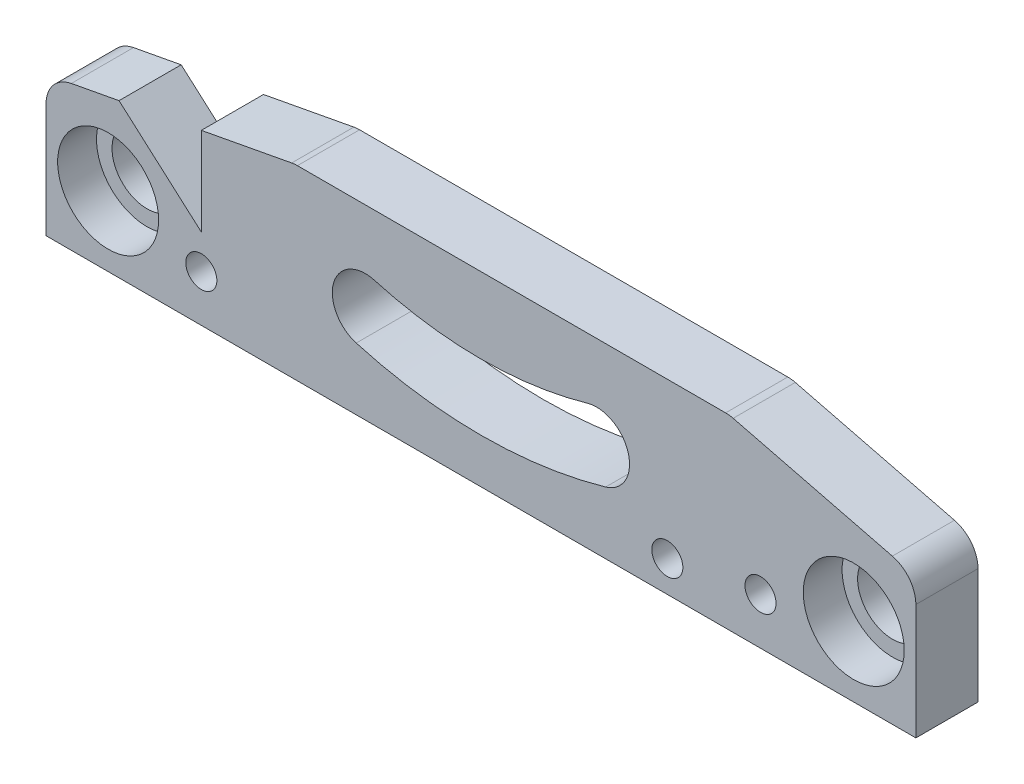
ISO-10303-21;
HEADER;
FILE_DESCRIPTION(('STEP AP214'),'2;1');
FILE_NAME('part.step','',(''),(''),'','','');
FILE_SCHEMA(('AUTOMOTIVE_DESIGN { 1 0 10303 214 1 1 1 1 }'));
ENDSEC;
DATA;
#1=APPLICATION_CONTEXT('core data for automotive mechanical design processes');
#2=APPLICATION_PROTOCOL_DEFINITION('international standard','automotive_design',2000,#1);
#3=PRODUCT_CONTEXT('',#1,'mechanical');
#4=PRODUCT('Part','Part','',(#3));
#5=PRODUCT_RELATED_PRODUCT_CATEGORY('part','',(#4));
#6=PRODUCT_DEFINITION_FORMATION('','',#4);
#7=PRODUCT_DEFINITION_CONTEXT('part definition',#1,'design');
#8=PRODUCT_DEFINITION('design','',#6,#7);
#9=PRODUCT_DEFINITION_SHAPE('','',#8);
#10=(LENGTH_UNIT() NAMED_UNIT(*) SI_UNIT(.MILLI.,.METRE.));
#11=(NAMED_UNIT(*) PLANE_ANGLE_UNIT() SI_UNIT($,.RADIAN.));
#12=(NAMED_UNIT(*) SI_UNIT($,.STERADIAN.) SOLID_ANGLE_UNIT());
#13=UNCERTAINTY_MEASURE_WITH_UNIT(LENGTH_MEASURE(1.E-05),#10,'distance_accuracy_value','');
#14=(GEOMETRIC_REPRESENTATION_CONTEXT(3) GLOBAL_UNCERTAINTY_ASSIGNED_CONTEXT((#13)) GLOBAL_UNIT_ASSIGNED_CONTEXT((#10,
#11,#12)) REPRESENTATION_CONTEXT('',''));
#15=CARTESIAN_POINT('',(0.,0.,0.));
#16=DIRECTION('',(0.,0.,1.));
#17=DIRECTION('',(1.,0.,0.));
#18=AXIS2_PLACEMENT_3D('',#15,#16,#17);
#19=CARTESIAN_POINT('',(-44.45,19.05,0.));
#20=DIRECTION('',(0.,0.,1.));
#21=DIRECTION('',(1.,0.,0.));
#22=AXIS2_PLACEMENT_3D('',#19,#20,#21);
#23=PLANE('',#22);
#24=CARTESIAN_POINT('',(-28.575,4.7625,0.));
#25=DIRECTION('',(0.,0.,1.));
#26=DIRECTION('',(1.,0.,0.));
#27=AXIS2_PLACEMENT_3D('',#24,#25,#26);
#28=CIRCLE('',#27,1.5875);
#29=CARTESIAN_POINT('',(-26.9875,4.7625,0.));
#30=VERTEX_POINT('',#29);
#31=EDGE_CURVE('E619',#30,#30,#28,.T.);
#32=ORIENTED_EDGE('',*,*,#31,.T.);
#33=EDGE_LOOP('',(#32));
#34=FACE_BOUND('',#33,.T.);
#35=CARTESIAN_POINT('',(19.05,3.17500000000001,0.));
#36=DIRECTION('',(0.,0.,1.));
#37=DIRECTION('',(1.,0.,0.));
#38=AXIS2_PLACEMENT_3D('',#35,#36,#37);
#39=CIRCLE('',#38,1.5875);
#40=CARTESIAN_POINT('',(20.6375,3.17500000000001,0.));
#41=VERTEX_POINT('',#40);
#42=EDGE_CURVE('E608',#41,#41,#39,.T.);
#43=ORIENTED_EDGE('',*,*,#42,.T.);
#44=EDGE_LOOP('',(#43));
#45=FACE_BOUND('',#44,.T.);
#46=CARTESIAN_POINT('',(28.575,4.7625,0.));
#47=DIRECTION('',(0.,0.,1.));
#48=DIRECTION('',(1.,0.,0.));
#49=AXIS2_PLACEMENT_3D('',#46,#47,#48);
#50=CIRCLE('',#49,1.5875);
#51=CARTESIAN_POINT('',(30.1625,4.7625,0.));
#52=VERTEX_POINT('',#51);
#53=EDGE_CURVE('E604',#52,#52,#50,.T.);
#54=ORIENTED_EDGE('',*,*,#53,.T.);
#55=EDGE_LOOP('',(#54));
#56=FACE_BOUND('',#55,.T.);
#57=CARTESIAN_POINT('',(-38.1,7.14375,0.));
#58=DIRECTION('',(0.,0.,1.));
#59=DIRECTION('',(1.,0.,0.));
#60=AXIS2_PLACEMENT_3D('',#57,#58,#59);
#61=CIRCLE('',#60,3.57187500000001);
#62=CARTESIAN_POINT('',(-34.528125,7.14375,0.));
#63=VERTEX_POINT('',#62);
#64=EDGE_CURVE('E592',#63,#63,#61,.T.);
#65=ORIENTED_EDGE('',*,*,#64,.T.);
#66=EDGE_LOOP('',(#65));
#67=FACE_BOUND('',#66,.T.);
#68=CARTESIAN_POINT('',(-11.8145061637062,9.59792055784382,0.));
#69=DIRECTION('',(0.,0.,-1.));
#70=DIRECTION('',(-1.,0.,0.));
#71=AXIS2_PLACEMENT_3D('',#68,#69,#70);
#72=CIRCLE('',#71,3.3734375);
#73=CARTESIAN_POINT('',(-12.74435155622,6.35516430545188,0.));
#74=VERTEX_POINT('',#73);
#75=CARTESIAN_POINT('',(-10.8846607711922,12.8406768102357,0.));
#76=VERTEX_POINT('',#75);
#77=EDGE_CURVE('E152',#74,#76,#72,.T.);
#78=ORIENTED_EDGE('',*,*,#77,.F.);
#79=CARTESIAN_POINT('',(0.,50.8,0.));
#80=DIRECTION('',(0.,0.,-1.));
#81=DIRECTION('',(-1.,0.,0.));
#82=AXIS2_PLACEMENT_3D('',#79,#80,#81);
#83=CIRCLE('',#82,46.2359375);
#84=CARTESIAN_POINT('',(12.7443515562201,6.35516430545189,0.));
#85=VERTEX_POINT('',#84);
#86=EDGE_CURVE('E177',#85,#74,#83,.T.);
#87=ORIENTED_EDGE('',*,*,#86,.F.);
#88=CARTESIAN_POINT('',(11.8145061637062,9.59792055784382,0.));
#89=DIRECTION('',(0.,0.,-1.));
#90=DIRECTION('',(-1.,0.,0.));
#91=AXIS2_PLACEMENT_3D('',#88,#89,#90);
#92=CIRCLE('',#91,3.3734375);
#93=CARTESIAN_POINT('',(10.8846607711922,12.8406768102357,0.));
#94=VERTEX_POINT('',#93);
#95=EDGE_CURVE('E175',#94,#85,#92,.T.);
#96=ORIENTED_EDGE('',*,*,#95,.F.);
#97=CARTESIAN_POINT('',(0.,50.8,0.));
#98=DIRECTION('',(0.,0.,1.));
#99=DIRECTION('',(1.,0.,0.));
#100=AXIS2_PLACEMENT_3D('',#97,#98,#99);
#101=CIRCLE('',#100,39.4890625);
#102=EDGE_CURVE('E162',#76,#94,#101,.T.);
#103=ORIENTED_EDGE('',*,*,#102,.F.);
#104=EDGE_LOOP('',(#78,#87,#96,#103));
#105=FACE_BOUND('',#104,.T.);
#106=DIRECTION('',(-0.970142500145332,0.242535625036333,0.));
#107=VECTOR('',#106,1.);
#108=CARTESIAN_POINT('',(44.45,14.2875,0.));
#109=LINE('',#108,#107);
#110=CARTESIAN_POINT('',(42.0450506094903,14.8887373476274,0.));
#111=VERTEX_POINT('',#110);
#112=CARTESIAN_POINT('',(25.7791902481543,18.9552024379614,0.));
#113=VERTEX_POINT('',#112);
#114=EDGE_CURVE('E220',#111,#113,#109,.T.);
#115=ORIENTED_EDGE('',*,*,#114,.F.);
#116=CARTESIAN_POINT('',(41.275,11.808534909666,0.));
#117=DIRECTION('',(0.,0.,1.));
#118=DIRECTION('',(1.,0.,0.));
#119=AXIS2_PLACEMENT_3D('',#116,#117,#118);
#120=CIRCLE('',#119,3.175);
#121=CARTESIAN_POINT('',(44.45,11.808534909666,0.));
#122=VERTEX_POINT('',#121);
#123=EDGE_CURVE('E273',#111,#122,#120,.F.);
#124=ORIENTED_EDGE('',*,*,#123,.T.);
#125=DIRECTION('',(0.,1.,0.));
#126=VECTOR('',#125,1.);
#127=CARTESIAN_POINT('',(44.45,0.,0.));
#128=LINE('',#127,#126);
#129=CARTESIAN_POINT('',(44.45,0.,0.));
#130=VERTEX_POINT('',#129);
#131=EDGE_CURVE('E242',#130,#122,#128,.T.);
#132=ORIENTED_EDGE('',*,*,#131,.F.);
#133=DIRECTION('',(-1.,0.,0.));
#134=VECTOR('',#133,1.);
#135=CARTESIAN_POINT('',(44.45,0.,0.));
#136=LINE('',#135,#134);
#137=CARTESIAN_POINT('',(-44.45,0.,0.));
#138=VERTEX_POINT('',#137);
#139=EDGE_CURVE('E245',#130,#138,#136,.T.);
#140=ORIENTED_EDGE('',*,*,#139,.T.);
#141=DIRECTION('',(0.,1.,0.));
#142=VECTOR('',#141,1.);
#143=CARTESIAN_POINT('',(-44.45,0.,0.));
#144=LINE('',#143,#142);
#145=CARTESIAN_POINT('',(-44.45,11.6524840379615,0.));
#146=VERTEX_POINT('',#145);
#147=EDGE_CURVE('E230',#138,#146,#144,.T.);
#148=ORIENTED_EDGE('',*,*,#147,.T.);
#149=CARTESIAN_POINT('',(-41.275,11.6524840379615,0.));
#150=DIRECTION('',(0.,0.,1.));
#151=DIRECTION('',(1.,0.,0.));
#152=AXIS2_PLACEMENT_3D('',#149,#150,#151);
#153=CIRCLE('',#152,3.175);
#154=CARTESIAN_POINT('',(-41.8601160987843,14.7731032314779,0.));
#155=VERTEX_POINT('',#154);
#156=EDGE_CURVE('E47',#146,#155,#153,.F.);
#157=ORIENTED_EDGE('',*,*,#156,.T.);
#158=DIRECTION('',(-0.982872186934322,-0.184288535050185,0.));
#159=VECTOR('',#158,1.);
#160=CARTESIAN_POINT('',(-43.587358490566,14.4492452830189,0.));
#161=LINE('',#160,#159);
#162=CARTESIAN_POINT('',(-36.9843867316346,15.6873024878185,0.));
#163=VERTEX_POINT('',#162);
#164=EDGE_CURVE('E216',#163,#155,#161,.T.);
#165=ORIENTED_EDGE('',*,*,#164,.F.);
#166=DIRECTION('',(0.749616947953284,-0.661871914603727,0.));
#167=VECTOR('',#166,1.);
#168=CARTESIAN_POINT('',(-36.9843867316346,15.6873024878185,0.));
#169=LINE('',#168,#167);
#170=CARTESIAN_POINT('',(-28.575,8.26226105578167,0.));
#171=VERTEX_POINT('',#170);
#172=EDGE_CURVE('E198',#163,#171,#169,.T.);
#173=ORIENTED_EDGE('',*,*,#172,.T.);
#174=DIRECTION('',(0.,1.,0.));
#175=VECTOR('',#174,1.);
#176=CARTESIAN_POINT('',(-28.575,8.26226105578167,0.));
#177=LINE('',#176,#175);
#178=CARTESIAN_POINT('',(-28.575,17.2640625,0.));
#179=VERTEX_POINT('',#178);
#180=EDGE_CURVE('E195',#171,#179,#177,.T.);
#181=ORIENTED_EDGE('',*,*,#180,.T.);
#182=CARTESIAN_POINT('',(-19.3400309679121,18.9956191935165,0.));
#183=VERTEX_POINT('',#182);
#184=EDGE_CURVE('E217',#183,#179,#161,.T.);
#185=ORIENTED_EDGE('',*,*,#184,.F.);
#186=CARTESIAN_POINT('',(-18.7549148691278,15.875,0.));
#187=DIRECTION('',(0.,0.,1.));
#188=DIRECTION('',(1.,0.,0.));
#189=AXIS2_PLACEMENT_3D('',#186,#187,#188);
#190=CIRCLE('',#189,3.175);
#191=CARTESIAN_POINT('',(-18.7549148691278,19.05,0.));
#192=VERTEX_POINT('',#191);
#193=EDGE_CURVE('E270',#183,#192,#190,.F.);
#194=ORIENTED_EDGE('',*,*,#193,.T.);
#195=DIRECTION('',(1.,0.,0.));
#196=VECTOR('',#195,1.);
#197=CARTESIAN_POINT('',(-44.45,19.05,0.));
#198=LINE('',#197,#196);
#199=CARTESIAN_POINT('',(25.0091396386639,19.05,0.));
#200=VERTEX_POINT('',#199);
#201=EDGE_CURVE('E223',#192,#200,#198,.T.);
#202=ORIENTED_EDGE('',*,*,#201,.T.);
#203=CARTESIAN_POINT('',(25.0091396386639,15.875,0.));
#204=DIRECTION('',(0.,0.,1.));
#205=DIRECTION('',(1.,0.,0.));
#206=AXIS2_PLACEMENT_3D('',#203,#204,#205);
#207=CIRCLE('',#206,3.175);
#208=EDGE_CURVE('E268',#200,#113,#207,.F.);
#209=ORIENTED_EDGE('',*,*,#208,.T.);
#210=EDGE_LOOP('',(#115,#124,#132,#140,#148,#157,#165,#173,#181,#185,#194,#202,#209));
#211=FACE_BOUND('',#210,.T.);
#212=CARTESIAN_POINT('',(38.1,7.14375,0.));
#213=DIRECTION('',(0.,0.,1.));
#214=DIRECTION('',(1.,0.,0.));
#215=AXIS2_PLACEMENT_3D('',#212,#213,#214);
#216=CIRCLE('',#215,3.57187500000001);
#217=CARTESIAN_POINT('',(41.671875,7.14375,0.));
#218=VERTEX_POINT('',#217);
#219=EDGE_CURVE('E184',#218,#218,#216,.T.);
#220=ORIENTED_EDGE('',*,*,#219,.T.);
#221=EDGE_LOOP('',(#220));
#222=FACE_BOUND('',#221,.T.);
#223=ADVANCED_FACE('F32',(#34,#45,#56,#67,#105,#211,#222),#23,.F.);
#224=CARTESIAN_POINT('',(-44.45,19.05,6.35));
#225=DIRECTION('',(0.,0.,1.));
#226=DIRECTION('',(1.,0.,0.));
#227=AXIS2_PLACEMENT_3D('',#224,#225,#226);
#228=PLANE('',#227);
#229=CARTESIAN_POINT('',(-28.575,4.7625,6.35));
#230=DIRECTION('',(0.,0.,1.));
#231=DIRECTION('',(1.,0.,0.));
#232=AXIS2_PLACEMENT_3D('',#229,#230,#231);
#233=CIRCLE('',#232,1.5875);
#234=CARTESIAN_POINT('',(-26.9875,4.7625,6.35));
#235=VERTEX_POINT('',#234);
#236=EDGE_CURVE('E614',#235,#235,#233,.T.);
#237=ORIENTED_EDGE('',*,*,#236,.F.);
#238=EDGE_LOOP('',(#237));
#239=FACE_BOUND('',#238,.T.);
#240=CARTESIAN_POINT('',(19.05,3.17500000000001,6.34999999994079));
#241=DIRECTION('',(0.,0.,1.));
#242=DIRECTION('',(1.,0.,0.));
#243=AXIS2_PLACEMENT_3D('',#240,#241,#242);
#244=CIRCLE('',#243,1.5875);
#245=CARTESIAN_POINT('',(20.6375,3.17500000000001,6.34999999994079));
#246=VERTEX_POINT('',#245);
#247=EDGE_CURVE('E611',#246,#246,#244,.T.);
#248=ORIENTED_EDGE('',*,*,#247,.F.);
#249=EDGE_LOOP('',(#248));
#250=FACE_BOUND('',#249,.T.);
#251=CARTESIAN_POINT('',(28.575,4.7625,6.35));
#252=DIRECTION('',(0.,0.,1.));
#253=DIRECTION('',(1.,0.,0.));
#254=AXIS2_PLACEMENT_3D('',#251,#252,#253);
#255=CIRCLE('',#254,1.5875);
#256=CARTESIAN_POINT('',(30.1625,4.7625,6.35));
#257=VERTEX_POINT('',#256);
#258=EDGE_CURVE('E605',#257,#257,#255,.T.);
#259=ORIENTED_EDGE('',*,*,#258,.F.);
#260=EDGE_LOOP('',(#259));
#261=FACE_BOUND('',#260,.T.);
#262=CARTESIAN_POINT('',(-38.1,7.14375,6.35));
#263=DIRECTION('',(0.,0.,1.));
#264=DIRECTION('',(1.,0.,0.));
#265=AXIS2_PLACEMENT_3D('',#262,#263,#264);
#266=CIRCLE('',#265,5.15937499999999);
#267=CARTESIAN_POINT('',(-32.940625,7.14375,6.35));
#268=VERTEX_POINT('',#267);
#269=EDGE_CURVE('E601',#268,#268,#266,.T.);
#270=ORIENTED_EDGE('',*,*,#269,.F.);
#271=EDGE_LOOP('',(#270));
#272=FACE_BOUND('',#271,.T.);
#273=CARTESIAN_POINT('',(0.,50.8,6.35));
#274=DIRECTION('',(0.,0.,-1.));
#275=DIRECTION('',(-1.,0.,0.));
#276=AXIS2_PLACEMENT_3D('',#273,#274,#275);
#277=CIRCLE('',#276,46.2359375);
#278=CARTESIAN_POINT('',(12.7443515562201,6.35516430545189,6.35));
#279=VERTEX_POINT('',#278);
#280=CARTESIAN_POINT('',(-12.74435155622,6.35516430545188,6.35));
#281=VERTEX_POINT('',#280);
#282=EDGE_CURVE('E163',#279,#281,#277,.T.);
#283=ORIENTED_EDGE('',*,*,#282,.T.);
#284=CARTESIAN_POINT('',(-11.8145061637062,9.59792055784382,6.35));
#285=DIRECTION('',(0.,0.,-1.));
#286=DIRECTION('',(-1.,0.,0.));
#287=AXIS2_PLACEMENT_3D('',#284,#285,#286);
#288=CIRCLE('',#287,3.3734375);
#289=CARTESIAN_POINT('',(-10.8846607711922,12.8406768102357,6.35));
#290=VERTEX_POINT('',#289);
#291=EDGE_CURVE('E182',#281,#290,#288,.T.);
#292=ORIENTED_EDGE('',*,*,#291,.T.);
#293=CARTESIAN_POINT('',(0.,50.8,6.35));
#294=DIRECTION('',(0.,0.,1.));
#295=DIRECTION('',(1.,0.,0.));
#296=AXIS2_PLACEMENT_3D('',#293,#294,#295);
#297=CIRCLE('',#296,39.4890625);
#298=CARTESIAN_POINT('',(10.8846607711922,12.8406768102357,6.35));
#299=VERTEX_POINT('',#298);
#300=EDGE_CURVE('E169',#290,#299,#297,.T.);
#301=ORIENTED_EDGE('',*,*,#300,.T.);
#302=CARTESIAN_POINT('',(11.8145061637062,9.59792055784382,6.35));
#303=DIRECTION('',(0.,0.,-1.));
#304=DIRECTION('',(-1.,0.,0.));
#305=AXIS2_PLACEMENT_3D('',#302,#303,#304);
#306=CIRCLE('',#305,3.3734375);
#307=EDGE_CURVE('E186',#299,#279,#306,.T.);
#308=ORIENTED_EDGE('',*,*,#307,.T.);
#309=EDGE_LOOP('',(#283,#292,#301,#308));
#310=FACE_BOUND('',#309,.T.);
#311=DIRECTION('',(0.,1.,0.));
#312=VECTOR('',#311,1.);
#313=CARTESIAN_POINT('',(44.45,0.,6.35));
#314=LINE('',#313,#312);
#315=CARTESIAN_POINT('',(44.45,0.,6.35));
#316=VERTEX_POINT('',#315);
#317=CARTESIAN_POINT('',(44.45,11.808534909666,6.35));
#318=VERTEX_POINT('',#317);
#319=EDGE_CURVE('E229',#316,#318,#314,.T.);
#320=ORIENTED_EDGE('',*,*,#319,.T.);
#321=CARTESIAN_POINT('',(41.275,11.808534909666,6.35));
#322=DIRECTION('',(0.,0.,1.));
#323=DIRECTION('',(1.,0.,0.));
#324=AXIS2_PLACEMENT_3D('',#321,#322,#323);
#325=CIRCLE('',#324,3.175);
#326=CARTESIAN_POINT('',(42.0450506094903,14.8887373476274,6.35));
#327=VERTEX_POINT('',#326);
#328=EDGE_CURVE('E261',#318,#327,#325,.T.);
#329=ORIENTED_EDGE('',*,*,#328,.T.);
#330=DIRECTION('',(-0.970142500145332,0.242535625036333,0.));
#331=VECTOR('',#330,1.);
#332=CARTESIAN_POINT('',(44.45,14.2875,6.35));
#333=LINE('',#332,#331);
#334=CARTESIAN_POINT('',(25.7791902481543,18.9552024379614,6.35));
#335=VERTEX_POINT('',#334);
#336=EDGE_CURVE('E219',#327,#335,#333,.T.);
#337=ORIENTED_EDGE('',*,*,#336,.T.);
#338=CARTESIAN_POINT('',(25.0091396386639,15.875,6.35));
#339=DIRECTION('',(0.,0.,1.));
#340=DIRECTION('',(1.,0.,0.));
#341=AXIS2_PLACEMENT_3D('',#338,#339,#340);
#342=CIRCLE('',#341,3.175);
#343=CARTESIAN_POINT('',(25.0091396386639,19.05,6.35));
#344=VERTEX_POINT('',#343);
#345=EDGE_CURVE('E255',#335,#344,#342,.T.);
#346=ORIENTED_EDGE('',*,*,#345,.T.);
#347=DIRECTION('',(1.,0.,0.));
#348=VECTOR('',#347,1.);
#349=CARTESIAN_POINT('',(-44.45,19.05,6.35));
#350=LINE('',#349,#348);
#351=CARTESIAN_POINT('',(-18.7549148691278,19.05,6.35));
#352=VERTEX_POINT('',#351);
#353=EDGE_CURVE('E226',#352,#344,#350,.T.);
#354=ORIENTED_EDGE('',*,*,#353,.F.);
#355=CARTESIAN_POINT('',(-18.7549148691278,15.875,6.35));
#356=DIRECTION('',(0.,0.,1.));
#357=DIRECTION('',(1.,0.,0.));
#358=AXIS2_PLACEMENT_3D('',#355,#356,#357);
#359=CIRCLE('',#358,3.175);
#360=CARTESIAN_POINT('',(-19.3400309679121,18.9956191935165,6.35));
#361=VERTEX_POINT('',#360);
#362=EDGE_CURVE('E257',#352,#361,#359,.T.);
#363=ORIENTED_EDGE('',*,*,#362,.T.);
#364=DIRECTION('',(0.982872186934322,0.184288535050185,0.));
#365=VECTOR('',#364,1.);
#366=CARTESIAN_POINT('',(-44.45,14.2875,6.35));
#367=LINE('',#366,#365);
#368=CARTESIAN_POINT('',(-28.575,17.2640625,6.35));
#369=VERTEX_POINT('',#368);
#370=EDGE_CURVE('E213',#369,#361,#367,.T.);
#371=ORIENTED_EDGE('',*,*,#370,.F.);
#372=DIRECTION('',(0.,1.,0.));
#373=VECTOR('',#372,1.);
#374=CARTESIAN_POINT('',(-28.575,8.26226105578167,6.35));
#375=LINE('',#374,#373);
#376=CARTESIAN_POINT('',(-28.575,8.26226105578167,6.35));
#377=VERTEX_POINT('',#376);
#378=EDGE_CURVE('E170',#377,#369,#375,.T.);
#379=ORIENTED_EDGE('',*,*,#378,.F.);
#380=DIRECTION('',(0.749616947953284,-0.661871914603727,0.));
#381=VECTOR('',#380,1.);
#382=CARTESIAN_POINT('',(-36.9843867316346,15.6873024878185,6.35));
#383=LINE('',#382,#381);
#384=CARTESIAN_POINT('',(-36.9843867316346,15.6873024878185,6.35));
#385=VERTEX_POINT('',#384);
#386=EDGE_CURVE('E199',#385,#377,#383,.T.);
#387=ORIENTED_EDGE('',*,*,#386,.F.);
#388=CARTESIAN_POINT('',(-41.8601160987843,14.7731032314779,6.35));
#389=VERTEX_POINT('',#388);
#390=EDGE_CURVE('E214',#389,#385,#367,.T.);
#391=ORIENTED_EDGE('',*,*,#390,.F.);
#392=CARTESIAN_POINT('',(-41.275,11.6524840379615,6.35));
#393=DIRECTION('',(0.,0.,1.));
#394=DIRECTION('',(1.,0.,0.));
#395=AXIS2_PLACEMENT_3D('',#392,#393,#394);
#396=CIRCLE('',#395,3.175);
#397=CARTESIAN_POINT('',(-44.45,11.6524840379615,6.35));
#398=VERTEX_POINT('',#397);
#399=EDGE_CURVE('E259',#389,#398,#396,.T.);
#400=ORIENTED_EDGE('',*,*,#399,.T.);
#401=DIRECTION('',(0.,1.,0.));
#402=VECTOR('',#401,1.);
#403=CARTESIAN_POINT('',(-44.45,0.,6.35));
#404=LINE('',#403,#402);
#405=CARTESIAN_POINT('',(-44.45,0.,6.35));
#406=VERTEX_POINT('',#405);
#407=EDGE_CURVE('E236',#406,#398,#404,.T.);
#408=ORIENTED_EDGE('',*,*,#407,.F.);
#409=DIRECTION('',(-1.,0.,0.));
#410=VECTOR('',#409,1.);
#411=CARTESIAN_POINT('',(44.45,0.,6.35));
#412=LINE('',#411,#410);
#413=EDGE_CURVE('E233',#316,#406,#412,.T.);
#414=ORIENTED_EDGE('',*,*,#413,.F.);
#415=EDGE_LOOP('',(#320,#329,#337,#346,#354,#363,#371,#379,#387,#391,#400,#408,#414));
#416=FACE_BOUND('',#415,.T.);
#417=CARTESIAN_POINT('',(38.1,7.14375,6.35));
#418=DIRECTION('',(0.,0.,1.));
#419=DIRECTION('',(1.,0.,0.));
#420=AXIS2_PLACEMENT_3D('',#417,#418,#419);
#421=CIRCLE('',#420,5.15937499999999);
#422=CARTESIAN_POINT('',(43.259375,7.14375,6.35));
#423=VERTEX_POINT('',#422);
#424=EDGE_CURVE('E589',#423,#423,#421,.T.);
#425=ORIENTED_EDGE('',*,*,#424,.F.);
#426=EDGE_LOOP('',(#425));
#427=FACE_BOUND('',#426,.T.);
#428=ADVANCED_FACE('F298',(#239,#250,#261,#272,#310,#416,#427),#228,.T.);
#429=CARTESIAN_POINT('',(-44.45,14.2875,6.35));
#430=DIRECTION('',(-0.184288535050185,0.982872186934322,0.));
#431=DIRECTION('',(-0.982872186934322,-0.184288535050185,0.));
#432=AXIS2_PLACEMENT_3D('',#429,#430,#431);
#433=PLANE('',#432);
#434=ORIENTED_EDGE('',*,*,#370,.T.);
#435=DIRECTION('',(0.,0.,-1.));
#436=VECTOR('',#435,1.);
#437=CARTESIAN_POINT('',(-19.3400309679121,18.9956191935165,6.35));
#438=LINE('',#437,#436);
#439=EDGE_CURVE('E279',#361,#183,#438,.T.);
#440=ORIENTED_EDGE('',*,*,#439,.T.);
#441=ORIENTED_EDGE('',*,*,#184,.T.);
#442=DIRECTION('',(0.,0.,1.));
#443=VECTOR('',#442,1.);
#444=CARTESIAN_POINT('',(-28.575,17.2640625,0.));
#445=LINE('',#444,#443);
#446=EDGE_CURVE('E210',#179,#369,#445,.T.);
#447=ORIENTED_EDGE('',*,*,#446,.T.);
#448=EDGE_LOOP('',(#434,#440,#441,#447));
#449=FACE_BOUND('',#448,.T.);
#450=ADVANCED_FACE('F333',(#449),#433,.T.);
#451=CARTESIAN_POINT('',(-44.45,19.05,6.35));
#452=DIRECTION('',(0.,1.,0.));
#453=DIRECTION('',(-1.,0.,0.));
#454=AXIS2_PLACEMENT_3D('',#451,#452,#453);
#455=PLANE('',#454);
#456=ORIENTED_EDGE('',*,*,#201,.F.);
#457=DIRECTION('',(0.,0.,-1.));
#458=VECTOR('',#457,1.);
#459=CARTESIAN_POINT('',(-18.7549148691278,19.05,6.35));
#460=LINE('',#459,#458);
#461=EDGE_CURVE('E11',#192,#352,#460,.F.);
#462=ORIENTED_EDGE('',*,*,#461,.T.);
#463=ORIENTED_EDGE('',*,*,#353,.T.);
#464=DIRECTION('',(0.,0.,1.));
#465=VECTOR('',#464,1.);
#466=CARTESIAN_POINT('',(25.0091396386639,19.05,6.35));
#467=LINE('',#466,#465);
#468=EDGE_CURVE('E40',#344,#200,#467,.F.);
#469=ORIENTED_EDGE('',*,*,#468,.T.);
#470=EDGE_LOOP('',(#456,#462,#463,#469));
#471=FACE_BOUND('',#470,.T.);
#472=ADVANCED_FACE('F284',(#471),#455,.T.);
#473=CARTESIAN_POINT('',(-44.45,0.,6.35));
#474=DIRECTION('',(-1.,0.,0.));
#475=DIRECTION('',(0.,-1.,0.));
#476=AXIS2_PLACEMENT_3D('',#473,#474,#475);
#477=PLANE('',#476);
#478=ORIENTED_EDGE('',*,*,#407,.T.);
#479=DIRECTION('',(0.,0.,-1.));
#480=VECTOR('',#479,1.);
#481=CARTESIAN_POINT('',(-44.45,11.6524840379615,6.35));
#482=LINE('',#481,#480);
#483=EDGE_CURVE('E275',#398,#146,#482,.T.);
#484=ORIENTED_EDGE('',*,*,#483,.T.);
#485=ORIENTED_EDGE('',*,*,#147,.F.);
#486=DIRECTION('',(0.,0.,-1.));
#487=VECTOR('',#486,1.);
#488=CARTESIAN_POINT('',(-44.45,0.,6.35));
#489=LINE('',#488,#487);
#490=EDGE_CURVE('E249',#406,#138,#489,.T.);
#491=ORIENTED_EDGE('',*,*,#490,.F.);
#492=EDGE_LOOP('',(#478,#484,#485,#491));
#493=FACE_BOUND('',#492,.T.);
#494=ADVANCED_FACE('F315',(#493),#477,.T.);
#495=CARTESIAN_POINT('',(44.45,0.,6.35));
#496=DIRECTION('',(-1.,0.,0.));
#497=DIRECTION('',(0.,-1.,0.));
#498=AXIS2_PLACEMENT_3D('',#495,#496,#497);
#499=PLANE('',#498);
#500=ORIENTED_EDGE('',*,*,#131,.T.);
#501=DIRECTION('',(0.,0.,1.));
#502=VECTOR('',#501,1.);
#503=CARTESIAN_POINT('',(44.45,11.808534909666,6.35));
#504=LINE('',#503,#502);
#505=EDGE_CURVE('E251',#122,#318,#504,.T.);
#506=ORIENTED_EDGE('',*,*,#505,.T.);
#507=ORIENTED_EDGE('',*,*,#319,.F.);
#508=DIRECTION('',(0.,0.,-1.));
#509=VECTOR('',#508,1.);
#510=CARTESIAN_POINT('',(44.45,0.,6.35));
#511=LINE('',#510,#509);
#512=EDGE_CURVE('E239',#316,#130,#511,.T.);
#513=ORIENTED_EDGE('',*,*,#512,.T.);
#514=EDGE_LOOP('',(#500,#506,#507,#513));
#515=FACE_BOUND('',#514,.T.);
#516=ADVANCED_FACE('F307',(#515),#499,.F.);
#517=CARTESIAN_POINT('',(44.45,0.,6.35));
#518=DIRECTION('',(0.,-1.,0.));
#519=DIRECTION('',(1.,0.,0.));
#520=AXIS2_PLACEMENT_3D('',#517,#518,#519);
#521=PLANE('',#520);
#522=ORIENTED_EDGE('',*,*,#139,.F.);
#523=ORIENTED_EDGE('',*,*,#512,.F.);
#524=ORIENTED_EDGE('',*,*,#413,.T.);
#525=ORIENTED_EDGE('',*,*,#490,.T.);
#526=EDGE_LOOP('',(#522,#523,#524,#525));
#527=FACE_BOUND('',#526,.T.);
#528=ADVANCED_FACE('F312',(#527),#521,.T.);
#529=CARTESIAN_POINT('',(44.45,14.2875,0.));
#530=DIRECTION('',(0.242535625036333,0.970142500145332,0.));
#531=DIRECTION('',(-0.970142500145332,0.242535625036333,0.));
#532=AXIS2_PLACEMENT_3D('',#529,#530,#531);
#533=PLANE('',#532);
#534=ORIENTED_EDGE('',*,*,#336,.F.);
#535=DIRECTION('',(0.,0.,1.));
#536=VECTOR('',#535,1.);
#537=CARTESIAN_POINT('',(42.0450506094903,14.8887373476274,0.));
#538=LINE('',#537,#536);
#539=EDGE_CURVE('E266',#327,#111,#538,.F.);
#540=ORIENTED_EDGE('',*,*,#539,.T.);
#541=ORIENTED_EDGE('',*,*,#114,.T.);
#542=DIRECTION('',(0.,0.,1.));
#543=VECTOR('',#542,1.);
#544=CARTESIAN_POINT('',(25.7791902481543,18.9552024379614,0.));
#545=LINE('',#544,#543);
#546=EDGE_CURVE('E263',#113,#335,#545,.T.);
#547=ORIENTED_EDGE('',*,*,#546,.T.);
#548=EDGE_LOOP('',(#534,#540,#541,#547));
#549=FACE_BOUND('',#548,.T.);
#550=ADVANCED_FACE('F295',(#549),#533,.T.);
#551=ORIENTED_EDGE('',*,*,#164,.T.);
#552=DIRECTION('',(0.,0.,-1.));
#553=VECTOR('',#552,1.);
#554=CARTESIAN_POINT('',(-41.8601160987843,14.7731032314779,6.35));
#555=LINE('',#554,#553);
#556=EDGE_CURVE('E277',#155,#389,#555,.F.);
#557=ORIENTED_EDGE('',*,*,#556,.T.);
#558=ORIENTED_EDGE('',*,*,#390,.T.);
#559=DIRECTION('',(0.,0.,1.));
#560=VECTOR('',#559,1.);
#561=CARTESIAN_POINT('',(-36.9843867316346,15.6873024878185,0.));
#562=LINE('',#561,#560);
#563=EDGE_CURVE('E202',#163,#385,#562,.T.);
#564=ORIENTED_EDGE('',*,*,#563,.F.);
#565=EDGE_LOOP('',(#551,#557,#558,#564));
#566=FACE_BOUND('',#565,.T.);
#567=ADVANCED_FACE('F323',(#566),#433,.T.);
#568=CARTESIAN_POINT('',(-28.575,8.26226105578167,0.));
#569=DIRECTION('',(1.,0.,0.));
#570=DIRECTION('',(0.,0.,-1.));
#571=AXIS2_PLACEMENT_3D('',#568,#569,#570);
#572=PLANE('',#571);
#573=ORIENTED_EDGE('',*,*,#378,.T.);
#574=ORIENTED_EDGE('',*,*,#446,.F.);
#575=ORIENTED_EDGE('',*,*,#180,.F.);
#576=DIRECTION('',(0.,0.,1.));
#577=VECTOR('',#576,1.);
#578=CARTESIAN_POINT('',(-28.575,8.26226105578167,0.));
#579=LINE('',#578,#577);
#580=EDGE_CURVE('E208',#171,#377,#579,.T.);
#581=ORIENTED_EDGE('',*,*,#580,.T.);
#582=EDGE_LOOP('',(#573,#574,#575,#581));
#583=FACE_BOUND('',#582,.T.);
#584=ADVANCED_FACE('F329',(#583),#572,.F.);
#585=CARTESIAN_POINT('',(-36.9843867316346,15.6873024878185,0.));
#586=DIRECTION('',(-0.661871914603727,-0.749616947953284,0.));
#587=DIRECTION('',(0.749616947953284,-0.661871914603727,0.));
#588=AXIS2_PLACEMENT_3D('',#585,#586,#587);
#589=PLANE('',#588);
#590=ORIENTED_EDGE('',*,*,#386,.T.);
#591=ORIENTED_EDGE('',*,*,#580,.F.);
#592=ORIENTED_EDGE('',*,*,#172,.F.);
#593=ORIENTED_EDGE('',*,*,#563,.T.);
#594=EDGE_LOOP('',(#590,#591,#592,#593));
#595=FACE_BOUND('',#594,.T.);
#596=ADVANCED_FACE('F325',(#595),#589,.F.);
#597=CARTESIAN_POINT('',(-11.8145061637062,9.59792055784382,0.));
#598=DIRECTION('',(0.,0.,1.));
#599=DIRECTION('',(1.,0.,0.));
#600=AXIS2_PLACEMENT_3D('',#597,#598,#599);
#601=CYLINDRICAL_SURFACE('',#600,3.3734375);
#602=ORIENTED_EDGE('',*,*,#291,.F.);
#603=DIRECTION('',(0.,0.,1.));
#604=VECTOR('',#603,1.);
#605=CARTESIAN_POINT('',(-12.74435155622,6.35516430545188,0.));
#606=LINE('',#605,#604);
#607=EDGE_CURVE('E158',#74,#281,#606,.T.);
#608=ORIENTED_EDGE('',*,*,#607,.F.);
#609=ORIENTED_EDGE('',*,*,#77,.T.);
#610=DIRECTION('',(0.,0.,1.));
#611=VECTOR('',#610,1.);
#612=CARTESIAN_POINT('',(-10.8846607711922,12.8406768102357,0.));
#613=LINE('',#612,#611);
#614=EDGE_CURVE('E155',#76,#290,#613,.T.);
#615=ORIENTED_EDGE('',*,*,#614,.T.);
#616=EDGE_LOOP('',(#602,#608,#609,#615));
#617=FACE_BOUND('',#616,.T.);
#618=ADVANCED_FACE('F154',(#617),#601,.F.);
#619=CARTESIAN_POINT('',(0.,50.8,0.));
#620=DIRECTION('',(0.,0.,1.));
#621=DIRECTION('',(1.,0.,0.));
#622=AXIS2_PLACEMENT_3D('',#619,#620,#621);
#623=CYLINDRICAL_SURFACE('',#622,39.4890625);
#624=ORIENTED_EDGE('',*,*,#300,.F.);
#625=ORIENTED_EDGE('',*,*,#614,.F.);
#626=ORIENTED_EDGE('',*,*,#102,.T.);
#627=DIRECTION('',(0.,0.,1.));
#628=VECTOR('',#627,1.);
#629=CARTESIAN_POINT('',(10.8846607711922,12.8406768102357,0.));
#630=LINE('',#629,#628);
#631=EDGE_CURVE('E171',#94,#299,#630,.T.);
#632=ORIENTED_EDGE('',*,*,#631,.T.);
#633=EDGE_LOOP('',(#624,#625,#626,#632));
#634=FACE_BOUND('',#633,.T.);
#635=ADVANCED_FACE('F166',(#634),#623,.T.);
#636=CARTESIAN_POINT('',(11.8145061637062,9.59792055784382,0.));
#637=DIRECTION('',(0.,0.,1.));
#638=DIRECTION('',(1.,0.,0.));
#639=AXIS2_PLACEMENT_3D('',#636,#637,#638);
#640=CYLINDRICAL_SURFACE('',#639,3.3734375);
#641=ORIENTED_EDGE('',*,*,#307,.F.);
#642=ORIENTED_EDGE('',*,*,#631,.F.);
#643=ORIENTED_EDGE('',*,*,#95,.T.);
#644=DIRECTION('',(0.,0.,1.));
#645=VECTOR('',#644,1.);
#646=CARTESIAN_POINT('',(12.7443515562201,6.35516430545189,0.));
#647=LINE('',#646,#645);
#648=EDGE_CURVE('E192',#85,#279,#647,.T.);
#649=ORIENTED_EDGE('',*,*,#648,.T.);
#650=EDGE_LOOP('',(#641,#642,#643,#649));
#651=FACE_BOUND('',#650,.T.);
#652=ADVANCED_FACE('F370',(#651),#640,.F.);
#653=CARTESIAN_POINT('',(0.,50.8,0.));
#654=DIRECTION('',(0.,0.,1.));
#655=DIRECTION('',(1.,0.,0.));
#656=AXIS2_PLACEMENT_3D('',#653,#654,#655);
#657=CYLINDRICAL_SURFACE('',#656,46.2359375);
#658=ORIENTED_EDGE('',*,*,#282,.F.);
#659=ORIENTED_EDGE('',*,*,#648,.F.);
#660=ORIENTED_EDGE('',*,*,#86,.T.);
#661=ORIENTED_EDGE('',*,*,#607,.T.);
#662=EDGE_LOOP('',(#658,#659,#660,#661));
#663=FACE_BOUND('',#662,.T.);
#664=ADVANCED_FACE('F366',(#663),#657,.F.);
#665=CARTESIAN_POINT('',(41.275,11.808534909666,6.35));
#666=DIRECTION('',(0.,0.,-1.));
#667=DIRECTION('',(-1.,0.,0.));
#668=AXIS2_PLACEMENT_3D('',#665,#666,#667);
#669=CYLINDRICAL_SURFACE('',#668,3.175);
#670=ORIENTED_EDGE('',*,*,#123,.F.);
#671=ORIENTED_EDGE('',*,*,#539,.F.);
#672=ORIENTED_EDGE('',*,*,#328,.F.);
#673=ORIENTED_EDGE('',*,*,#505,.F.);
#674=EDGE_LOOP('',(#670,#671,#672,#673));
#675=FACE_BOUND('',#674,.T.);
#676=ADVANCED_FACE('F305',(#675),#669,.T.);
#677=CARTESIAN_POINT('',(-41.275,11.6524840379615,6.35));
#678=DIRECTION('',(0.,0.,-1.));
#679=DIRECTION('',(-1.,0.,0.));
#680=AXIS2_PLACEMENT_3D('',#677,#678,#679);
#681=CYLINDRICAL_SURFACE('',#680,3.175);
#682=ORIENTED_EDGE('',*,*,#399,.F.);
#683=ORIENTED_EDGE('',*,*,#556,.F.);
#684=ORIENTED_EDGE('',*,*,#156,.F.);
#685=ORIENTED_EDGE('',*,*,#483,.F.);
#686=EDGE_LOOP('',(#682,#683,#684,#685));
#687=FACE_BOUND('',#686,.T.);
#688=ADVANCED_FACE('F317',(#687),#681,.T.);
#689=CARTESIAN_POINT('',(-18.7549148691278,15.875,6.35));
#690=DIRECTION('',(0.,0.,-1.));
#691=DIRECTION('',(-1.,0.,0.));
#692=AXIS2_PLACEMENT_3D('',#689,#690,#691);
#693=CYLINDRICAL_SURFACE('',#692,3.175);
#694=ORIENTED_EDGE('',*,*,#362,.F.);
#695=ORIENTED_EDGE('',*,*,#461,.F.);
#696=ORIENTED_EDGE('',*,*,#193,.F.);
#697=ORIENTED_EDGE('',*,*,#439,.F.);
#698=EDGE_LOOP('',(#694,#695,#696,#697));
#699=FACE_BOUND('',#698,.T.);
#700=ADVANCED_FACE('F337',(#699),#693,.T.);
#701=CARTESIAN_POINT('',(25.0091396386639,15.875,0.));
#702=DIRECTION('',(0.,0.,1.));
#703=DIRECTION('',(1.,0.,0.));
#704=AXIS2_PLACEMENT_3D('',#701,#702,#703);
#705=CYLINDRICAL_SURFACE('',#704,3.175);
#706=ORIENTED_EDGE('',*,*,#208,.F.);
#707=ORIENTED_EDGE('',*,*,#468,.F.);
#708=ORIENTED_EDGE('',*,*,#345,.F.);
#709=ORIENTED_EDGE('',*,*,#546,.F.);
#710=EDGE_LOOP('',(#706,#707,#708,#709));
#711=FACE_BOUND('',#710,.T.);
#712=ADVANCED_FACE('F34',(#711),#705,.T.);
#713=CARTESIAN_POINT('',(38.1,7.14375,6.35));
#714=DIRECTION('',(0.,0.,1.));
#715=DIRECTION('',(1.,0.,0.));
#716=AXIS2_PLACEMENT_3D('',#713,#714,#715);
#717=CYLINDRICAL_SURFACE('',#716,3.571875);
#718=CARTESIAN_POINT('',(38.1,7.14375,2.38125));
#719=DIRECTION('',(0.,0.,1.));
#720=DIRECTION('',(1.,0.,0.));
#721=AXIS2_PLACEMENT_3D('',#718,#719,#720);
#722=CIRCLE('',#721,3.57187499999999);
#723=CARTESIAN_POINT('',(41.671875,7.14375,2.38125));
#724=VERTEX_POINT('',#723);
#725=EDGE_CURVE('E581',#724,#724,#722,.T.);
#726=ORIENTED_EDGE('',*,*,#725,.T.);
#727=EDGE_LOOP('',(#726));
#728=FACE_BOUND('',#727,.T.);
#729=ORIENTED_EDGE('',*,*,#219,.F.);
#730=EDGE_LOOP('',(#729));
#731=FACE_BOUND('',#730,.T.);
#732=ADVANCED_FACE('F343',(#728,#731),#717,.F.);
#733=CARTESIAN_POINT('',(41.671875,7.14375,2.38125));
#734=DIRECTION('',(0.,0.,1.));
#735=DIRECTION('',(1.,0.,0.));
#736=AXIS2_PLACEMENT_3D('',#733,#734,#735);
#737=PLANE('',#736);
#738=CARTESIAN_POINT('',(38.1,7.14375,2.38125));
#739=DIRECTION('',(0.,0.,1.));
#740=DIRECTION('',(1.,0.,0.));
#741=AXIS2_PLACEMENT_3D('',#738,#739,#740);
#742=CIRCLE('',#741,5.15937499999999);
#743=CARTESIAN_POINT('',(43.259375,7.14375,2.38125));
#744=VERTEX_POINT('',#743);
#745=EDGE_CURVE('E584',#744,#744,#742,.T.);
#746=ORIENTED_EDGE('',*,*,#745,.T.);
#747=EDGE_LOOP('',(#746));
#748=FACE_BOUND('',#747,.T.);
#749=ORIENTED_EDGE('',*,*,#725,.F.);
#750=EDGE_LOOP('',(#749));
#751=FACE_BOUND('',#750,.T.);
#752=ADVANCED_FACE('F526',(#748,#751),#737,.T.);
#753=CARTESIAN_POINT('',(38.1,7.14375,6.35));
#754=DIRECTION('',(0.,0.,1.));
#755=DIRECTION('',(1.,0.,0.));
#756=AXIS2_PLACEMENT_3D('',#753,#754,#755);
#757=CYLINDRICAL_SURFACE('',#756,5.15937499999999);
#758=ORIENTED_EDGE('',*,*,#424,.T.);
#759=EDGE_LOOP('',(#758));
#760=FACE_BOUND('',#759,.T.);
#761=ORIENTED_EDGE('',*,*,#745,.F.);
#762=EDGE_LOOP('',(#761));
#763=FACE_BOUND('',#762,.T.);
#764=ADVANCED_FACE('F518',(#760,#763),#757,.F.);
#765=CARTESIAN_POINT('',(-38.1,7.14375,6.35));
#766=DIRECTION('',(0.,0.,1.));
#767=DIRECTION('',(1.,0.,0.));
#768=AXIS2_PLACEMENT_3D('',#765,#766,#767);
#769=CYLINDRICAL_SURFACE('',#768,3.571875);
#770=CARTESIAN_POINT('',(-38.1,7.14375,2.38125));
#771=DIRECTION('',(0.,0.,1.));
#772=DIRECTION('',(1.,0.,0.));
#773=AXIS2_PLACEMENT_3D('',#770,#771,#772);
#774=CIRCLE('',#773,3.57187499999999);
#775=CARTESIAN_POINT('',(-34.528125,7.14375,2.38125));
#776=VERTEX_POINT('',#775);
#777=EDGE_CURVE('E595',#776,#776,#774,.T.);
#778=ORIENTED_EDGE('',*,*,#777,.T.);
#779=EDGE_LOOP('',(#778));
#780=FACE_BOUND('',#779,.T.);
#781=ORIENTED_EDGE('',*,*,#64,.F.);
#782=EDGE_LOOP('',(#781));
#783=FACE_BOUND('',#782,.T.);
#784=ADVANCED_FACE('F510',(#780,#783),#769,.F.);
#785=CARTESIAN_POINT('',(-34.528125,7.14375,2.38125));
#786=DIRECTION('',(0.,0.,1.));
#787=DIRECTION('',(1.,0.,0.));
#788=AXIS2_PLACEMENT_3D('',#785,#786,#787);
#789=PLANE('',#788);
#790=CARTESIAN_POINT('',(-38.1,7.14375,2.38125));
#791=DIRECTION('',(0.,0.,1.));
#792=DIRECTION('',(1.,0.,0.));
#793=AXIS2_PLACEMENT_3D('',#790,#791,#792);
#794=CIRCLE('',#793,5.15937499999999);
#795=CARTESIAN_POINT('',(-32.940625,7.14375,2.38125));
#796=VERTEX_POINT('',#795);
#797=EDGE_CURVE('E598',#796,#796,#794,.T.);
#798=ORIENTED_EDGE('',*,*,#797,.T.);
#799=EDGE_LOOP('',(#798));
#800=FACE_BOUND('',#799,.T.);
#801=ORIENTED_EDGE('',*,*,#777,.F.);
#802=EDGE_LOOP('',(#801));
#803=FACE_BOUND('',#802,.T.);
#804=ADVANCED_FACE('F502',(#800,#803),#789,.T.);
#805=CARTESIAN_POINT('',(-38.1,7.14375,6.35));
#806=DIRECTION('',(0.,0.,1.));
#807=DIRECTION('',(1.,0.,0.));
#808=AXIS2_PLACEMENT_3D('',#805,#806,#807);
#809=CYLINDRICAL_SURFACE('',#808,5.15937499999999);
#810=ORIENTED_EDGE('',*,*,#269,.T.);
#811=EDGE_LOOP('',(#810));
#812=FACE_BOUND('',#811,.T.);
#813=ORIENTED_EDGE('',*,*,#797,.F.);
#814=EDGE_LOOP('',(#813));
#815=FACE_BOUND('',#814,.T.);
#816=ADVANCED_FACE('F494',(#812,#815),#809,.F.);
#817=CARTESIAN_POINT('',(28.575,4.7625,0.));
#818=DIRECTION('',(0.,0.,1.));
#819=DIRECTION('',(1.,0.,0.));
#820=AXIS2_PLACEMENT_3D('',#817,#818,#819);
#821=CYLINDRICAL_SURFACE('',#820,1.5875);
#822=ORIENTED_EDGE('',*,*,#53,.F.);
#823=EDGE_LOOP('',(#822));
#824=FACE_BOUND('',#823,.T.);
#825=ORIENTED_EDGE('',*,*,#258,.T.);
#826=EDGE_LOOP('',(#825));
#827=FACE_BOUND('',#826,.T.);
#828=ADVANCED_FACE('F487',(#824,#827),#821,.F.);
#829=CARTESIAN_POINT('',(19.05,3.17500000000001,0.));
#830=DIRECTION('',(0.,0.,1.));
#831=DIRECTION('',(1.,0.,0.));
#832=AXIS2_PLACEMENT_3D('',#829,#830,#831);
#833=CYLINDRICAL_SURFACE('',#832,1.5875);
#834=ORIENTED_EDGE('',*,*,#42,.F.);
#835=EDGE_LOOP('',(#834));
#836=FACE_BOUND('',#835,.T.);
#837=ORIENTED_EDGE('',*,*,#247,.T.);
#838=EDGE_LOOP('',(#837));
#839=FACE_BOUND('',#838,.T.);
#840=ADVANCED_FACE('F477',(#836,#839),#833,.F.);
#841=CARTESIAN_POINT('',(-28.575,4.7625,0.));
#842=DIRECTION('',(0.,0.,1.));
#843=DIRECTION('',(1.,0.,0.));
#844=AXIS2_PLACEMENT_3D('',#841,#842,#843);
#845=CYLINDRICAL_SURFACE('',#844,1.5875);
#846=ORIENTED_EDGE('',*,*,#31,.F.);
#847=EDGE_LOOP('',(#846));
#848=FACE_BOUND('',#847,.T.);
#849=ORIENTED_EDGE('',*,*,#236,.T.);
#850=EDGE_LOOP('',(#849));
#851=FACE_BOUND('',#850,.T.);
#852=ADVANCED_FACE('F473',(#848,#851),#845,.F.);
#853=CLOSED_SHELL('',(#223,#428,#450,#472,#494,#516,#528,#550,#567,#584,#596,#618,#635,#652,
#664,#676,#688,#700,#712,#732,#752,#764,#784,#804,#816,#828,#840,#852));
#854=MANIFOLD_SOLID_BREP('B2',#853);
#855=ADVANCED_BREP_SHAPE_REPRESENTATION('',(#18,#854),#14);
#856=SHAPE_DEFINITION_REPRESENTATION(#9,#855);
ENDSEC;
END-ISO-10303-21;
